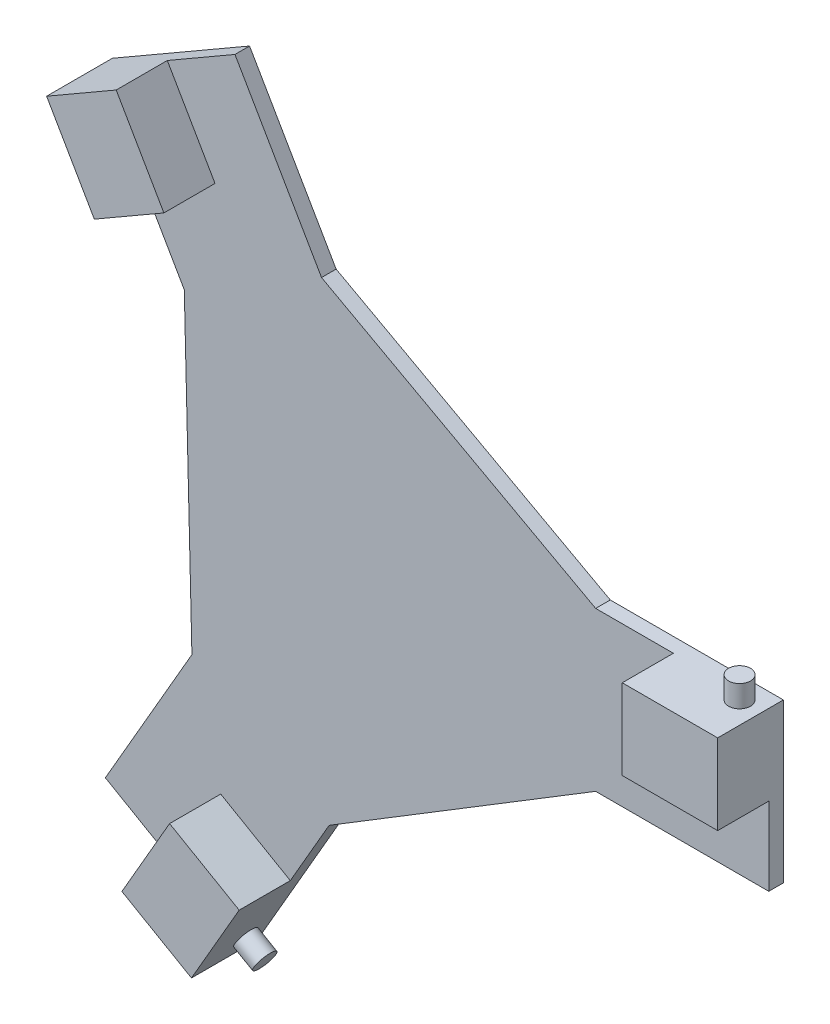
ISO-10303-21;
HEADER;
FILE_DESCRIPTION(('STEP AP214'),'2;1');
FILE_NAME('part.step','',(''),(''),'','','');
FILE_SCHEMA(('AUTOMOTIVE_DESIGN { 1 0 10303 214 1 1 1 1 }'));
ENDSEC;
DATA;
#1=APPLICATION_CONTEXT('core data for automotive mechanical design processes');
#2=APPLICATION_PROTOCOL_DEFINITION('international standard','automotive_design',2000,#1);
#3=PRODUCT_CONTEXT('',#1,'mechanical');
#4=PRODUCT('Part','Part','',(#3));
#5=PRODUCT_RELATED_PRODUCT_CATEGORY('part','',(#4));
#6=PRODUCT_DEFINITION_FORMATION('','',#4);
#7=PRODUCT_DEFINITION_CONTEXT('part definition',#1,'design');
#8=PRODUCT_DEFINITION('design','',#6,#7);
#9=PRODUCT_DEFINITION_SHAPE('','',#8);
#10=(LENGTH_UNIT() NAMED_UNIT(*) SI_UNIT(.MILLI.,.METRE.));
#11=(NAMED_UNIT(*) PLANE_ANGLE_UNIT() SI_UNIT($,.RADIAN.));
#12=(NAMED_UNIT(*) SI_UNIT($,.STERADIAN.) SOLID_ANGLE_UNIT());
#13=UNCERTAINTY_MEASURE_WITH_UNIT(LENGTH_MEASURE(1.E-05),#10,'distance_accuracy_value','');
#14=(GEOMETRIC_REPRESENTATION_CONTEXT(3) GLOBAL_UNCERTAINTY_ASSIGNED_CONTEXT((#13)) GLOBAL_UNIT_ASSIGNED_CONTEXT((#10,
#11,#12)) REPRESENTATION_CONTEXT('',''));
#15=CARTESIAN_POINT('',(0.,0.,0.));
#16=DIRECTION('',(0.,0.,1.));
#17=DIRECTION('',(1.,0.,0.));
#18=AXIS2_PLACEMENT_3D('',#15,#16,#17);
#19=CARTESIAN_POINT('',(30.9389921504268,11.4514451465866,2.));
#20=DIRECTION('',(0.,1.,0.));
#21=DIRECTION('',(0.,0.,1.));
#22=AXIS2_PLACEMENT_3D('',#19,#20,#21);
#23=PLANE('',#22);
#24=DIRECTION('',(1.,0.,0.));
#25=VECTOR('',#24,1.);
#26=CARTESIAN_POINT('',(30.9389921504268,11.4514451465866,0.));
#27=LINE('',#26,#25);
#28=CARTESIAN_POINT('',(30.9389921504268,11.4514451465866,0.));
#29=VERTEX_POINT('',#28);
#30=CARTESIAN_POINT('',(54.6454926293253,11.4514451465866,0.));
#31=VERTEX_POINT('',#30);
#32=EDGE_CURVE('E319',#29,#31,#27,.T.);
#33=ORIENTED_EDGE('',*,*,#32,.F.);
#34=DIRECTION('',(0.,0.,-1.));
#35=VECTOR('',#34,1.);
#36=CARTESIAN_POINT('',(30.9389921504268,11.4514451465866,2.));
#37=LINE('',#36,#35);
#38=CARTESIAN_POINT('',(30.9389921504268,11.4514451465866,2.));
#39=VERTEX_POINT('',#38);
#40=EDGE_CURVE('E341',#39,#29,#37,.T.);
#41=ORIENTED_EDGE('',*,*,#40,.F.);
#42=DIRECTION('',(1.,0.,0.));
#43=VECTOR('',#42,1.);
#44=CARTESIAN_POINT('',(30.9389921504268,11.4514451465866,2.));
#45=LINE('',#44,#43);
#46=CARTESIAN_POINT('',(41.5807599716743,11.4514451465866,2.));
#47=VERTEX_POINT('',#46);
#48=EDGE_CURVE('E381',#39,#47,#45,.T.);
#49=ORIENTED_EDGE('',*,*,#48,.T.);
#50=DIRECTION('',(0.,0.,-1.));
#51=VECTOR('',#50,1.);
#52=CARTESIAN_POINT('',(41.5807599716744,11.451445146586,8.99999999999999));
#53=LINE('',#52,#51);
#54=CARTESIAN_POINT('',(41.5807599716744,11.451445146586,8.99999999999999));
#55=VERTEX_POINT('',#54);
#56=EDGE_CURVE('E237',#55,#47,#53,.T.);
#57=ORIENTED_EDGE('',*,*,#56,.F.);
#58=DIRECTION('',(-1.,0.,0.));
#59=VECTOR('',#58,1.);
#60=CARTESIAN_POINT('',(41.5807599716744,11.451445146586,8.99999999999999));
#61=LINE('',#60,#59);
#62=CARTESIAN_POINT('',(54.6454926293255,11.4514451465858,8.99999999999999));
#63=VERTEX_POINT('',#62);
#64=EDGE_CURVE('E223',#63,#55,#61,.T.);
#65=ORIENTED_EDGE('',*,*,#64,.F.);
#66=DIRECTION('',(0.,0.,-1.));
#67=VECTOR('',#66,1.);
#68=CARTESIAN_POINT('',(54.6454926293253,11.4514451465866,2.));
#69=LINE('',#68,#67);
#70=EDGE_CURVE('E343',#63,#31,#69,.T.);
#71=ORIENTED_EDGE('',*,*,#70,.T.);
#72=EDGE_LOOP('',(#33,#41,#49,#57,#65,#71));
#73=FACE_BOUND('',#72,.T.);
#74=CARTESIAN_POINT('',(51.6454926293224,11.4514451465866,2.99999999999295));
#75=DIRECTION('',(0.,1.,0.));
#76=DIRECTION('',(0.,0.,1.));
#77=AXIS2_PLACEMENT_3D('',#74,#75,#76);
#78=CIRCLE('',#77,1.5);
#79=CARTESIAN_POINT('',(51.6454926293224,11.4514451465866,4.49999999999296));
#80=VERTEX_POINT('',#79);
#81=EDGE_CURVE('E697',#80,#80,#78,.T.);
#82=ORIENTED_EDGE('',*,*,#81,.F.);
#83=EDGE_LOOP('',(#82));
#84=FACE_BOUND('',#83,.T.);
#85=ADVANCED_FACE('F32',(#73,#84),#23,.T.);
#86=CARTESIAN_POINT('',(-5.55225366822558,-32.5196757430502,2.));
#87=DIRECTION('',(0.866025403784436,-0.500000000000004,0.));
#88=DIRECTION('',(0.500000000000004,0.866025403784436,0.));
#89=AXIS2_PLACEMENT_3D('',#86,#87,#88);
#90=PLANE('',#89);
#91=DIRECTION('',(-0.500000000000004,-0.866025403784436,0.));
#92=VECTOR('',#91,1.);
#93=CARTESIAN_POINT('',(-5.55225366822558,-32.5196757430502,0.));
#94=LINE('',#93,#92);
#95=CARTESIAN_POINT('',(-5.55225366822558,-32.5196757430502,0.));
#96=VERTEX_POINT('',#95);
#97=CARTESIAN_POINT('',(-17.4055039076749,-53.0501073926042,0.));
#98=VERTEX_POINT('',#97);
#99=EDGE_CURVE('E308',#96,#98,#94,.T.);
#100=ORIENTED_EDGE('',*,*,#99,.F.);
#101=DIRECTION('',(0.,0.,-1.));
#102=VECTOR('',#101,1.);
#103=CARTESIAN_POINT('',(-5.55225366822558,-32.5196757430502,2.));
#104=LINE('',#103,#102);
#105=CARTESIAN_POINT('',(-5.55225366822558,-32.5196757430502,2.));
#106=VERTEX_POINT('',#105);
#107=EDGE_CURVE('E186',#106,#96,#104,.T.);
#108=ORIENTED_EDGE('',*,*,#107,.F.);
#109=DIRECTION('',(-0.500000000000004,-0.866025403784436,0.));
#110=VECTOR('',#109,1.);
#111=CARTESIAN_POINT('',(-5.55225366822558,-32.5196757430502,2.));
#112=LINE('',#111,#110);
#113=CARTESIAN_POINT('',(-10.8731375788499,-41.7357170174261,2.));
#114=VERTEX_POINT('',#113);
#115=EDGE_CURVE('E364',#106,#114,#112,.T.);
#116=ORIENTED_EDGE('',*,*,#115,.T.);
#117=DIRECTION('',(0.,0.,-1.));
#118=VECTOR('',#117,1.);
#119=CARTESIAN_POINT('',(-10.8731375788499,-41.7357170174261,8.99999999999999));
#120=LINE('',#119,#118);
#121=CARTESIAN_POINT('',(-10.8731375788499,-41.7357170174261,8.99999999999999));
#122=VERTEX_POINT('',#121);
#123=EDGE_CURVE('E193',#122,#114,#120,.T.);
#124=ORIENTED_EDGE('',*,*,#123,.F.);
#125=DIRECTION('',(0.500000000000016,0.866025403784429,0.));
#126=VECTOR('',#125,1.);
#127=CARTESIAN_POINT('',(-10.8731375788499,-41.7357170174261,8.99999999999999));
#128=LINE('',#127,#126);
#129=CARTESIAN_POINT('',(-17.4055039076757,-53.050107392604,8.99999999999999));
#130=VERTEX_POINT('',#129);
#131=EDGE_CURVE('E189',#130,#122,#128,.T.);
#132=ORIENTED_EDGE('',*,*,#131,.F.);
#133=DIRECTION('',(0.,0.,-1.));
#134=VECTOR('',#133,1.);
#135=CARTESIAN_POINT('',(-17.4055039076749,-53.0501073926042,2.));
#136=LINE('',#135,#134);
#137=EDGE_CURVE('E175',#130,#98,#136,.T.);
#138=ORIENTED_EDGE('',*,*,#137,.T.);
#139=EDGE_LOOP('',(#100,#108,#116,#124,#132,#138));
#140=FACE_BOUND('',#139,.T.);
#141=CARTESIAN_POINT('',(-15.905503907675,-50.452031181251,3.05755616312808));
#142=DIRECTION('',(0.866025403784436,-0.500000000000004,0.));
#143=DIRECTION('',(0.500000000000004,0.866025403784436,0.));
#144=AXIS2_PLACEMENT_3D('',#141,#142,#143);
#145=CIRCLE('',#144,1.5);
#146=CARTESIAN_POINT('',(-15.155503907675,-49.1529930755744,3.05755616312808));
#147=VERTEX_POINT('',#146);
#148=EDGE_CURVE('E696',#147,#147,#145,.T.);
#149=ORIENTED_EDGE('',*,*,#148,.F.);
#150=EDGE_LOOP('',(#149));
#151=FACE_BOUND('',#150,.T.);
#152=ADVANCED_FACE('F190',(#140,#151),#90,.T.);
#153=CARTESIAN_POINT('',(-25.3867384822012,21.0682305964639,2.));
#154=DIRECTION('',(-0.866025403784443,-0.499999999999992,0.));
#155=DIRECTION('',(0.499999999999992,-0.866025403784443,0.));
#156=AXIS2_PLACEMENT_3D('',#153,#154,#155);
#157=PLANE('',#156);
#158=DIRECTION('',(-0.499999999999992,0.866025403784443,0.));
#159=VECTOR('',#158,1.);
#160=CARTESIAN_POINT('',(-25.3867384822012,21.0682305964639,2.));
#161=LINE('',#160,#159);
#162=CARTESIAN_POINT('',(-25.3867384822012,21.0682305964639,2.));
#163=VERTEX_POINT('',#162);
#164=CARTESIAN_POINT('',(-30.7076223928248,30.28427187084,2.));
#165=VERTEX_POINT('',#164);
#166=EDGE_CURVE('E288',#163,#165,#161,.T.);
#167=ORIENTED_EDGE('',*,*,#166,.T.);
#168=DIRECTION('',(0.,0.,1.));
#169=VECTOR('',#168,1.);
#170=CARTESIAN_POINT('',(-30.7076223928248,30.28427187084,8.85423510445075));
#171=LINE('',#170,#169);
#172=CARTESIAN_POINT('',(-30.7076223928248,30.28427187084,8.99999999999999));
#173=VERTEX_POINT('',#172);
#174=EDGE_CURVE('E252',#165,#173,#171,.T.);
#175=ORIENTED_EDGE('',*,*,#174,.T.);
#176=DIRECTION('',(0.499999999999992,-0.866025403784443,0.));
#177=VECTOR('',#176,1.);
#178=CARTESIAN_POINT('',(-30.7076223928248,30.28427187084,8.99999999999999));
#179=LINE('',#178,#177);
#180=CARTESIAN_POINT('',(-37.2399887216502,41.5986622460181,8.99999999999999));
#181=VERTEX_POINT('',#180);
#182=EDGE_CURVE('E240',#181,#173,#179,.T.);
#183=ORIENTED_EDGE('',*,*,#182,.F.);
#184=DIRECTION('',(0.,0.,-1.));
#185=VECTOR('',#184,1.);
#186=CARTESIAN_POINT('',(-37.2399887216502,41.5986622460181,2.));
#187=LINE('',#186,#185);
#188=CARTESIAN_POINT('',(-37.2399887216502,41.5986622460181,0.));
#189=VERTEX_POINT('',#188);
#190=EDGE_CURVE('E335',#181,#189,#187,.T.);
#191=ORIENTED_EDGE('',*,*,#190,.T.);
#192=DIRECTION('',(-0.499999999999992,0.866025403784443,0.));
#193=VECTOR('',#192,1.);
#194=CARTESIAN_POINT('',(-25.3867384822012,21.0682305964639,0.));
#195=LINE('',#194,#193);
#196=CARTESIAN_POINT('',(-25.3867384822012,21.0682305964639,0.));
#197=VERTEX_POINT('',#196);
#198=EDGE_CURVE('E331',#197,#189,#195,.T.);
#199=ORIENTED_EDGE('',*,*,#198,.F.);
#200=DIRECTION('',(0.,0.,-1.));
#201=VECTOR('',#200,1.);
#202=CARTESIAN_POINT('',(-25.3867384822012,21.0682305964639,2.));
#203=LINE('',#202,#201);
#204=EDGE_CURVE('E291',#163,#197,#203,.T.);
#205=ORIENTED_EDGE('',*,*,#204,.F.);
#206=EDGE_LOOP('',(#167,#175,#183,#191,#199,#205));
#207=FACE_BOUND('',#206,.T.);
#208=CARTESIAN_POINT('',(-35.7399887216488,39.0005860346621,2.99999999999295));
#209=DIRECTION('',(-0.866025403784443,-0.499999999999992,0.));
#210=DIRECTION('',(0.499999999999992,-0.866025403784443,0.));
#211=AXIS2_PLACEMENT_3D('',#208,#209,#210);
#212=CIRCLE('',#211,1.5);
#213=CARTESIAN_POINT('',(-34.9899887216488,37.7015479289855,2.99999999999295));
#214=VERTEX_POINT('',#213);
#215=EDGE_CURVE('E207',#214,#214,#212,.T.);
#216=ORIENTED_EDGE('',*,*,#215,.F.);
#217=EDGE_LOOP('',(#216));
#218=FACE_BOUND('',#217,.T.);
#219=ADVANCED_FACE('F392',(#207,#218),#157,.T.);
#220=CARTESIAN_POINT('',(-24.6218759073957,-10.2460298679985,2.));
#221=DIRECTION('',(0.,0.,-1.));
#222=DIRECTION('',(-1.,0.,0.));
#223=AXIS2_PLACEMENT_3D('',#220,#221,#222);
#224=PLANE('',#223);
#225=DIRECTION('',(-0.866025403784429,0.500000000000016,0.));
#226=VECTOR('',#225,1.);
#227=CARTESIAN_POINT('',(-20.3994170204787,-36.2357170174259,2.));
#228=LINE('',#227,#226);
#229=CARTESIAN_POINT('',(-20.3994170204787,-36.2357170174259,2.));
#230=VERTEX_POINT('',#229);
#231=EDGE_CURVE('E204',#114,#230,#228,.T.);
#232=ORIENTED_EDGE('',*,*,#231,.F.);
#233=ORIENTED_EDGE('',*,*,#115,.F.);
#234=DIRECTION('',(0.853558137972642,0.520997605657335,0.));
#235=VECTOR('',#234,1.);
#236=CARTESIAN_POINT('',(-5.55225366822558,-32.5196757430502,2.));
#237=LINE('',#236,#235);
#238=CARTESIAN_POINT('',(30.9389921504268,-10.2460298679985,2.));
#239=VERTEX_POINT('',#238);
#240=EDGE_CURVE('E367',#106,#239,#237,.T.);
#241=ORIENTED_EDGE('',*,*,#240,.T.);
#242=DIRECTION('',(-1.,0.,0.));
#243=VECTOR('',#242,1.);
#244=CARTESIAN_POINT('',(54.6454926293253,-10.2460298679985,2.));
#245=LINE('',#244,#243);
#246=CARTESIAN_POINT('',(54.6454926293253,-10.2460298679985,2.));
#247=VERTEX_POINT('',#246);
#248=EDGE_CURVE('E371',#247,#239,#245,.T.);
#249=ORIENTED_EDGE('',*,*,#248,.F.);
#250=DIRECTION('',(0.,-1.,0.));
#251=VECTOR('',#250,1.);
#252=CARTESIAN_POINT('',(54.6454926293253,11.4514451465866,2.));
#253=LINE('',#252,#251);
#254=CARTESIAN_POINT('',(54.6454926293253,0.451445146585797,2.));
#255=VERTEX_POINT('',#254);
#256=EDGE_CURVE('E379',#255,#247,#253,.T.);
#257=ORIENTED_EDGE('',*,*,#256,.F.);
#258=DIRECTION('',(1.,0.,0.));
#259=VECTOR('',#258,1.);
#260=CARTESIAN_POINT('',(54.6454926293253,0.451445146585797,2.));
#261=LINE('',#260,#259);
#262=CARTESIAN_POINT('',(41.5807599716743,0.451445146585981,2.));
#263=VERTEX_POINT('',#262);
#264=EDGE_CURVE('E49',#263,#255,#261,.T.);
#265=ORIENTED_EDGE('',*,*,#264,.F.);
#266=DIRECTION('',(0.,-1.,0.));
#267=VECTOR('',#266,1.);
#268=CARTESIAN_POINT('',(41.5807599716743,0.451445146585981,2.));
#269=LINE('',#268,#267);
#270=EDGE_CURVE('E53',#47,#263,#269,.T.);
#271=ORIENTED_EDGE('',*,*,#270,.F.);
#272=ORIENTED_EDGE('',*,*,#48,.F.);
#273=DIRECTION('',(0.877976230796439,-0.478704228262585,0.));
#274=VECTOR('',#273,1.);
#275=CARTESIAN_POINT('',(-6.59617392159228,31.9169681037563,2.));
#276=LINE('',#275,#274);
#277=CARTESIAN_POINT('',(-6.59617392159228,31.9169681037563,2.));
#278=VERTEX_POINT('',#277);
#279=EDGE_CURVE('E293',#278,#39,#276,.T.);
#280=ORIENTED_EDGE('',*,*,#279,.F.);
#281=DIRECTION('',(0.499999999999992,-0.866025403784443,0.));
#282=VECTOR('',#281,1.);
#283=CARTESIAN_POINT('',(-18.4494241610413,52.4473997533104,2.));
#284=LINE('',#283,#282);
#285=CARTESIAN_POINT('',(-18.4494241610413,52.4473997533104,2.));
#286=VERTEX_POINT('',#285);
#287=EDGE_CURVE('E287',#286,#278,#284,.T.);
#288=ORIENTED_EDGE('',*,*,#287,.F.);
#289=DIRECTION('',(0.866025403784443,0.499999999999992,0.));
#290=VECTOR('',#289,1.);
#291=CARTESIAN_POINT('',(-37.2399887216502,41.5986622460181,2.));
#292=LINE('',#291,#290);
#293=CARTESIAN_POINT('',(-27.7137092800214,47.098662246018,2.));
#294=VERTEX_POINT('',#293);
#295=EDGE_CURVE('E278',#294,#286,#292,.T.);
#296=ORIENTED_EDGE('',*,*,#295,.F.);
#297=DIRECTION('',(0.499999999999992,-0.866025403784443,0.));
#298=VECTOR('',#297,1.);
#299=CARTESIAN_POINT('',(-21.1813429511959,35.7842718708399,2.));
#300=LINE('',#299,#298);
#301=CARTESIAN_POINT('',(-21.1813429511959,35.7842718708399,2.));
#302=VERTEX_POINT('',#301);
#303=EDGE_CURVE('E256',#294,#302,#300,.T.);
#304=ORIENTED_EDGE('',*,*,#303,.T.);
#305=DIRECTION('',(-0.866025403784443,-0.499999999999992,0.));
#306=VECTOR('',#305,1.);
#307=CARTESIAN_POINT('',(-21.1813429511959,35.7842718708399,2.));
#308=LINE('',#307,#306);
#309=EDGE_CURVE('E262',#302,#165,#308,.T.);
#310=ORIENTED_EDGE('',*,*,#309,.T.);
#311=ORIENTED_EDGE('',*,*,#166,.F.);
#312=DIRECTION('',(0.0244180928237938,-0.999701833919919,0.));
#313=VECTOR('',#312,1.);
#314=CARTESIAN_POINT('',(-25.3867384822012,21.0682305964639,2.));
#315=LINE('',#314,#313);
#316=CARTESIAN_POINT('',(-24.3428182288343,-21.6709382357576,2.));
#317=VERTEX_POINT('',#316);
#318=EDGE_CURVE('E259',#163,#317,#315,.T.);
#319=ORIENTED_EDGE('',*,*,#318,.T.);
#320=DIRECTION('',(0.500000000000004,0.866025403784436,0.));
#321=VECTOR('',#320,1.);
#322=CARTESIAN_POINT('',(-36.1960684682837,-42.2013698853116,2.));
#323=LINE('',#322,#321);
#324=CARTESIAN_POINT('',(-36.1960684682837,-42.2013698853116,2.));
#325=VERTEX_POINT('',#324);
#326=EDGE_CURVE('E375',#325,#317,#323,.T.);
#327=ORIENTED_EDGE('',*,*,#326,.F.);
#328=DIRECTION('',(-0.866025403784436,0.500000000000004,0.));
#329=VECTOR('',#328,1.);
#330=CARTESIAN_POINT('',(-17.4055039076749,-53.0501073926042,2.));
#331=LINE('',#330,#329);
#332=CARTESIAN_POINT('',(-26.9317833493044,-47.5501073926038,2.));
#333=VERTEX_POINT('',#332);
#334=EDGE_CURVE('E352',#333,#325,#331,.T.);
#335=ORIENTED_EDGE('',*,*,#334,.F.);
#336=DIRECTION('',(-0.500000000000016,-0.866025403784429,0.));
#337=VECTOR('',#336,1.);
#338=CARTESIAN_POINT('',(-26.9317833493044,-47.5501073926038,2.));
#339=LINE('',#338,#337);
#340=EDGE_CURVE('E202',#230,#333,#339,.T.);
#341=ORIENTED_EDGE('',*,*,#340,.F.);
#342=EDGE_LOOP('',(#232,#233,#241,#249,#257,#265,#271,#272,#280,#288,#296,#304,#310,#311,#319,
#327,#335,#341));
#343=FACE_BOUND('',#342,.T.);
#344=ADVANCED_FACE('F284',(#343),#224,.F.);
#345=CARTESIAN_POINT('',(-25.3867384822012,21.0682305964639,2.));
#346=DIRECTION('',(0.999701833919919,0.0244180928237938,0.));
#347=DIRECTION('',(-0.0244180928237938,0.999701833919919,0.));
#348=AXIS2_PLACEMENT_3D('',#345,#346,#347);
#349=PLANE('',#348);
#350=DIRECTION('',(0.0244180928237938,-0.999701833919919,0.));
#351=VECTOR('',#350,1.);
#352=CARTESIAN_POINT('',(-25.3867384822012,21.0682305964639,0.));
#353=LINE('',#352,#351);
#354=CARTESIAN_POINT('',(-24.3428182288343,-21.6709382357576,0.));
#355=VERTEX_POINT('',#354);
#356=EDGE_CURVE('E266',#197,#355,#353,.T.);
#357=ORIENTED_EDGE('',*,*,#356,.T.);
#358=DIRECTION('',(0.,0.,-1.));
#359=VECTOR('',#358,1.);
#360=CARTESIAN_POINT('',(-24.3428182288343,-21.6709382357576,2.));
#361=LINE('',#360,#359);
#362=EDGE_CURVE('E11',#317,#355,#361,.T.);
#363=ORIENTED_EDGE('',*,*,#362,.F.);
#364=ORIENTED_EDGE('',*,*,#318,.F.);
#365=ORIENTED_EDGE('',*,*,#204,.T.);
#366=EDGE_LOOP('',(#357,#363,#364,#365));
#367=FACE_BOUND('',#366,.T.);
#368=ADVANCED_FACE('F34',(#367),#349,.F.);
#369=CARTESIAN_POINT('',(-36.1960684682837,-42.2013698853116,2.));
#370=DIRECTION('',(-0.866025403784436,0.500000000000004,0.));
#371=DIRECTION('',(-0.500000000000004,-0.866025403784436,0.));
#372=AXIS2_PLACEMENT_3D('',#369,#370,#371);
#373=PLANE('',#372);
#374=DIRECTION('',(0.500000000000004,0.866025403784436,0.));
#375=VECTOR('',#374,1.);
#376=CARTESIAN_POINT('',(-36.1960684682837,-42.2013698853116,0.));
#377=LINE('',#376,#375);
#378=CARTESIAN_POINT('',(-36.1960684682837,-42.2013698853116,0.));
#379=VERTEX_POINT('',#378);
#380=EDGE_CURVE('E304',#379,#355,#377,.T.);
#381=ORIENTED_EDGE('',*,*,#380,.F.);
#382=DIRECTION('',(0.,0.,-1.));
#383=VECTOR('',#382,1.);
#384=CARTESIAN_POINT('',(-36.1960684682837,-42.2013698853116,2.));
#385=LINE('',#384,#383);
#386=EDGE_CURVE('E41',#325,#379,#385,.T.);
#387=ORIENTED_EDGE('',*,*,#386,.F.);
#388=ORIENTED_EDGE('',*,*,#326,.T.);
#389=ORIENTED_EDGE('',*,*,#362,.T.);
#390=EDGE_LOOP('',(#381,#387,#388,#389));
#391=FACE_BOUND('',#390,.T.);
#392=ADVANCED_FACE('F356',(#391),#373,.T.);
#393=CARTESIAN_POINT('',(-17.4055039076749,-53.0501073926042,2.));
#394=DIRECTION('',(-0.500000000000004,-0.866025403784436,0.));
#395=DIRECTION('',(0.866025403784436,-0.500000000000004,0.));
#396=AXIS2_PLACEMENT_3D('',#393,#394,#395);
#397=PLANE('',#396);
#398=DIRECTION('',(-0.866025403784436,0.500000000000004,0.));
#399=VECTOR('',#398,1.);
#400=CARTESIAN_POINT('',(-17.4055039076749,-53.0501073926042,0.));
#401=LINE('',#400,#399);
#402=EDGE_CURVE('E182',#98,#379,#401,.T.);
#403=ORIENTED_EDGE('',*,*,#402,.F.);
#404=ORIENTED_EDGE('',*,*,#137,.F.);
#405=DIRECTION('',(0.86602540378443,-0.500000000000016,0.));
#406=VECTOR('',#405,1.);
#407=CARTESIAN_POINT('',(-17.4055039076757,-53.050107392604,8.99999999999999));
#408=LINE('',#407,#406);
#409=CARTESIAN_POINT('',(-26.9317833493044,-47.5501073926038,8.99999999999999));
#410=VERTEX_POINT('',#409);
#411=EDGE_CURVE('E180',#410,#130,#408,.T.);
#412=ORIENTED_EDGE('',*,*,#411,.F.);
#413=DIRECTION('',(0.,0.,-1.));
#414=VECTOR('',#413,1.);
#415=CARTESIAN_POINT('',(-26.9317833493044,-47.5501073926038,8.99999999999999));
#416=LINE('',#415,#414);
#417=EDGE_CURVE('E212',#410,#333,#416,.T.);
#418=ORIENTED_EDGE('',*,*,#417,.T.);
#419=ORIENTED_EDGE('',*,*,#334,.T.);
#420=ORIENTED_EDGE('',*,*,#386,.T.);
#421=EDGE_LOOP('',(#403,#404,#412,#418,#419,#420));
#422=FACE_BOUND('',#421,.T.);
#423=ADVANCED_FACE('F177',(#422),#397,.T.);
#424=CARTESIAN_POINT('',(-5.55225366822558,-32.5196757430502,2.));
#425=DIRECTION('',(-0.520997605657335,0.853558137972642,0.));
#426=DIRECTION('',(-0.853558137972642,-0.520997605657335,0.));
#427=AXIS2_PLACEMENT_3D('',#424,#425,#426);
#428=PLANE('',#427);
#429=DIRECTION('',(0.853558137972642,0.520997605657335,0.));
#430=VECTOR('',#429,1.);
#431=CARTESIAN_POINT('',(-5.55225366822558,-32.5196757430502,0.));
#432=LINE('',#431,#430);
#433=CARTESIAN_POINT('',(30.9389921504268,-10.2460298679985,0.));
#434=VERTEX_POINT('',#433);
#435=EDGE_CURVE('E310',#96,#434,#432,.T.);
#436=ORIENTED_EDGE('',*,*,#435,.T.);
#437=DIRECTION('',(0.,0.,-1.));
#438=VECTOR('',#437,1.);
#439=CARTESIAN_POINT('',(30.9389921504268,-10.2460298679985,2.));
#440=LINE('',#439,#438);
#441=EDGE_CURVE('E347',#239,#434,#440,.T.);
#442=ORIENTED_EDGE('',*,*,#441,.F.);
#443=ORIENTED_EDGE('',*,*,#240,.F.);
#444=ORIENTED_EDGE('',*,*,#107,.T.);
#445=EDGE_LOOP('',(#436,#442,#443,#444));
#446=FACE_BOUND('',#445,.T.);
#447=ADVANCED_FACE('F368',(#446),#428,.F.);
#448=CARTESIAN_POINT('',(54.6454926293253,-10.2460298679985,2.));
#449=DIRECTION('',(0.,-1.,0.));
#450=DIRECTION('',(0.,0.,-1.));
#451=AXIS2_PLACEMENT_3D('',#448,#449,#450);
#452=PLANE('',#451);
#453=DIRECTION('',(-1.,0.,0.));
#454=VECTOR('',#453,1.);
#455=CARTESIAN_POINT('',(54.6454926293253,-10.2460298679985,0.));
#456=LINE('',#455,#454);
#457=CARTESIAN_POINT('',(54.6454926293253,-10.2460298679985,0.));
#458=VERTEX_POINT('',#457);
#459=EDGE_CURVE('E313',#458,#434,#456,.T.);
#460=ORIENTED_EDGE('',*,*,#459,.F.);
#461=DIRECTION('',(0.,0.,-1.));
#462=VECTOR('',#461,1.);
#463=CARTESIAN_POINT('',(54.6454926293253,-10.2460298679985,2.));
#464=LINE('',#463,#462);
#465=EDGE_CURVE('E345',#247,#458,#464,.T.);
#466=ORIENTED_EDGE('',*,*,#465,.F.);
#467=ORIENTED_EDGE('',*,*,#248,.T.);
#468=ORIENTED_EDGE('',*,*,#441,.T.);
#469=EDGE_LOOP('',(#460,#466,#467,#468));
#470=FACE_BOUND('',#469,.T.);
#471=ADVANCED_FACE('F425',(#470),#452,.T.);
#472=CARTESIAN_POINT('',(54.6454926293253,11.4514451465866,2.));
#473=DIRECTION('',(1.,0.,0.));
#474=DIRECTION('',(0.,0.,-1.));
#475=AXIS2_PLACEMENT_3D('',#472,#473,#474);
#476=PLANE('',#475);
#477=DIRECTION('',(0.,-1.,0.));
#478=VECTOR('',#477,1.);
#479=CARTESIAN_POINT('',(54.6454926293253,11.4514451465866,0.));
#480=LINE('',#479,#478);
#481=EDGE_CURVE('E316',#31,#458,#480,.T.);
#482=ORIENTED_EDGE('',*,*,#481,.F.);
#483=ORIENTED_EDGE('',*,*,#70,.F.);
#484=DIRECTION('',(0.,1.,0.));
#485=VECTOR('',#484,1.);
#486=CARTESIAN_POINT('',(54.6454926293255,11.4514451465858,8.99999999999999));
#487=LINE('',#486,#485);
#488=CARTESIAN_POINT('',(54.6454926293253,0.451445146585797,8.99999999999999));
#489=VERTEX_POINT('',#488);
#490=EDGE_CURVE('E220',#489,#63,#487,.T.);
#491=ORIENTED_EDGE('',*,*,#490,.F.);
#492=DIRECTION('',(0.,0.,-1.));
#493=VECTOR('',#492,1.);
#494=CARTESIAN_POINT('',(54.6454926293253,0.451445146585797,8.99999999999999));
#495=LINE('',#494,#493);
#496=EDGE_CURVE('E229',#489,#255,#495,.T.);
#497=ORIENTED_EDGE('',*,*,#496,.T.);
#498=ORIENTED_EDGE('',*,*,#256,.T.);
#499=ORIENTED_EDGE('',*,*,#465,.T.);
#500=EDGE_LOOP('',(#482,#483,#491,#497,#498,#499));
#501=FACE_BOUND('',#500,.T.);
#502=ADVANCED_FACE('F422',(#501),#476,.T.);
#503=CARTESIAN_POINT('',(-6.59617392159228,31.9169681037563,2.));
#504=DIRECTION('',(0.478704228262585,0.877976230796439,0.));
#505=DIRECTION('',(-0.87797623079644,0.478704228262585,0.));
#506=AXIS2_PLACEMENT_3D('',#503,#504,#505);
#507=PLANE('',#506);
#508=DIRECTION('',(0.877976230796439,-0.478704228262585,0.));
#509=VECTOR('',#508,1.);
#510=CARTESIAN_POINT('',(-6.59617392159228,31.9169681037563,0.));
#511=LINE('',#510,#509);
#512=CARTESIAN_POINT('',(-6.59617392159228,31.9169681037563,0.));
#513=VERTEX_POINT('',#512);
#514=EDGE_CURVE('E322',#513,#29,#511,.T.);
#515=ORIENTED_EDGE('',*,*,#514,.F.);
#516=DIRECTION('',(0.,0.,-1.));
#517=VECTOR('',#516,1.);
#518=CARTESIAN_POINT('',(-6.59617392159228,31.9169681037563,2.));
#519=LINE('',#518,#517);
#520=EDGE_CURVE('E339',#278,#513,#519,.T.);
#521=ORIENTED_EDGE('',*,*,#520,.F.);
#522=ORIENTED_EDGE('',*,*,#279,.T.);
#523=ORIENTED_EDGE('',*,*,#40,.T.);
#524=EDGE_LOOP('',(#515,#521,#522,#523));
#525=FACE_BOUND('',#524,.T.);
#526=ADVANCED_FACE('F385',(#525),#507,.T.);
#527=CARTESIAN_POINT('',(-18.4494241610413,52.4473997533104,2.));
#528=DIRECTION('',(0.866025403784443,0.499999999999992,0.));
#529=DIRECTION('',(-0.499999999999992,0.866025403784443,0.));
#530=AXIS2_PLACEMENT_3D('',#527,#528,#529);
#531=PLANE('',#530);
#532=DIRECTION('',(0.499999999999992,-0.866025403784443,0.));
#533=VECTOR('',#532,1.);
#534=CARTESIAN_POINT('',(-18.4494241610413,52.4473997533104,0.));
#535=LINE('',#534,#533);
#536=CARTESIAN_POINT('',(-18.4494241610413,52.4473997533104,0.));
#537=VERTEX_POINT('',#536);
#538=EDGE_CURVE('E325',#537,#513,#535,.T.);
#539=ORIENTED_EDGE('',*,*,#538,.F.);
#540=DIRECTION('',(0.,0.,-1.));
#541=VECTOR('',#540,1.);
#542=CARTESIAN_POINT('',(-18.4494241610413,52.4473997533104,2.));
#543=LINE('',#542,#541);
#544=EDGE_CURVE('E337',#286,#537,#543,.T.);
#545=ORIENTED_EDGE('',*,*,#544,.F.);
#546=ORIENTED_EDGE('',*,*,#287,.T.);
#547=ORIENTED_EDGE('',*,*,#520,.T.);
#548=EDGE_LOOP('',(#539,#545,#546,#547));
#549=FACE_BOUND('',#548,.T.);
#550=ADVANCED_FACE('F389',(#549),#531,.T.);
#551=CARTESIAN_POINT('',(-37.2399887216502,41.5986622460181,2.));
#552=DIRECTION('',(-0.499999999999992,0.866025403784443,0.));
#553=DIRECTION('',(-0.866025403784443,-0.499999999999992,0.));
#554=AXIS2_PLACEMENT_3D('',#551,#552,#553);
#555=PLANE('',#554);
#556=DIRECTION('',(0.866025403784443,0.499999999999992,0.));
#557=VECTOR('',#556,1.);
#558=CARTESIAN_POINT('',(-37.2399887216502,41.5986622460181,0.));
#559=LINE('',#558,#557);
#560=EDGE_CURVE('E328',#189,#537,#559,.T.);
#561=ORIENTED_EDGE('',*,*,#560,.F.);
#562=ORIENTED_EDGE('',*,*,#190,.F.);
#563=DIRECTION('',(-0.866025403784443,-0.499999999999992,0.));
#564=VECTOR('',#563,1.);
#565=CARTESIAN_POINT('',(-37.2399887216502,41.5986622460181,8.99999999999999));
#566=LINE('',#565,#564);
#567=CARTESIAN_POINT('',(-27.7137092800214,47.098662246018,8.99999999999999));
#568=VERTEX_POINT('',#567);
#569=EDGE_CURVE('E249',#568,#181,#566,.T.);
#570=ORIENTED_EDGE('',*,*,#569,.F.);
#571=DIRECTION('',(0.,0.,-1.));
#572=VECTOR('',#571,1.);
#573=CARTESIAN_POINT('',(-27.7137092800214,47.098662246018,2.));
#574=LINE('',#573,#572);
#575=EDGE_CURVE('E255',#568,#294,#574,.T.);
#576=ORIENTED_EDGE('',*,*,#575,.T.);
#577=ORIENTED_EDGE('',*,*,#295,.T.);
#578=ORIENTED_EDGE('',*,*,#544,.T.);
#579=EDGE_LOOP('',(#561,#562,#570,#576,#577,#578));
#580=FACE_BOUND('',#579,.T.);
#581=ADVANCED_FACE('F277',(#580),#555,.T.);
#582=CARTESIAN_POINT('',(-24.6218759073957,-10.2460298679985,0.));
#583=DIRECTION('',(0.,0.,-1.));
#584=DIRECTION('',(-1.,0.,0.));
#585=AXIS2_PLACEMENT_3D('',#582,#583,#584);
#586=PLANE('',#585);
#587=ORIENTED_EDGE('',*,*,#356,.F.);
#588=ORIENTED_EDGE('',*,*,#198,.T.);
#589=ORIENTED_EDGE('',*,*,#560,.T.);
#590=ORIENTED_EDGE('',*,*,#538,.T.);
#591=ORIENTED_EDGE('',*,*,#514,.T.);
#592=ORIENTED_EDGE('',*,*,#32,.T.);
#593=ORIENTED_EDGE('',*,*,#481,.T.);
#594=ORIENTED_EDGE('',*,*,#459,.T.);
#595=ORIENTED_EDGE('',*,*,#435,.F.);
#596=ORIENTED_EDGE('',*,*,#99,.T.);
#597=ORIENTED_EDGE('',*,*,#402,.T.);
#598=ORIENTED_EDGE('',*,*,#380,.T.);
#599=EDGE_LOOP('',(#587,#588,#589,#590,#591,#592,#593,#594,#595,#596,#597,#598));
#600=FACE_BOUND('',#599,.T.);
#601=ADVANCED_FACE('F360',(#600),#586,.T.);
#602=CARTESIAN_POINT('',(-21.1813429511959,35.7842718708399,8.85423510445075));
#603=DIRECTION('',(0.499999999999992,-0.866025403784443,0.));
#604=DIRECTION('',(0.866025403784443,0.499999999999992,0.));
#605=AXIS2_PLACEMENT_3D('',#602,#603,#604);
#606=PLANE('',#605);
#607=ORIENTED_EDGE('',*,*,#174,.F.);
#608=ORIENTED_EDGE('',*,*,#309,.F.);
#609=DIRECTION('',(0.,0.,1.));
#610=VECTOR('',#609,1.);
#611=CARTESIAN_POINT('',(-21.1813429511959,35.7842718708399,8.85423510445075));
#612=LINE('',#611,#610);
#613=CARTESIAN_POINT('',(-21.1813429511959,35.7842718708399,8.99999999999999));
#614=VERTEX_POINT('',#613);
#615=EDGE_CURVE('E253',#302,#614,#612,.T.);
#616=ORIENTED_EDGE('',*,*,#615,.T.);
#617=DIRECTION('',(0.866025403784443,0.499999999999992,0.));
#618=VECTOR('',#617,1.);
#619=CARTESIAN_POINT('',(-21.1813429511959,35.7842718708399,8.99999999999999));
#620=LINE('',#619,#618);
#621=EDGE_CURVE('E243',#173,#614,#620,.T.);
#622=ORIENTED_EDGE('',*,*,#621,.F.);
#623=EDGE_LOOP('',(#607,#608,#616,#622));
#624=FACE_BOUND('',#623,.T.);
#625=ADVANCED_FACE('F402',(#624),#606,.T.);
#626=CARTESIAN_POINT('',(-27.7137092800214,47.098662246018,2.));
#627=DIRECTION('',(0.866025403784443,0.499999999999992,0.));
#628=DIRECTION('',(-0.499999999999992,0.866025403784443,0.));
#629=AXIS2_PLACEMENT_3D('',#626,#627,#628);
#630=PLANE('',#629);
#631=ORIENTED_EDGE('',*,*,#303,.F.);
#632=ORIENTED_EDGE('',*,*,#575,.F.);
#633=DIRECTION('',(-0.499999999999992,0.866025403784443,0.));
#634=VECTOR('',#633,1.);
#635=CARTESIAN_POINT('',(-27.7137092800214,47.098662246018,8.99999999999999));
#636=LINE('',#635,#634);
#637=EDGE_CURVE('E246',#614,#568,#636,.T.);
#638=ORIENTED_EDGE('',*,*,#637,.F.);
#639=ORIENTED_EDGE('',*,*,#615,.F.);
#640=EDGE_LOOP('',(#631,#632,#638,#639));
#641=FACE_BOUND('',#640,.T.);
#642=ADVANCED_FACE('F400',(#641),#630,.T.);
#643=CARTESIAN_POINT('',(-37.2399887216502,41.5986622460181,8.99999999999999));
#644=DIRECTION('',(0.,0.,-1.));
#645=DIRECTION('',(-1.,0.,0.));
#646=AXIS2_PLACEMENT_3D('',#643,#644,#645);
#647=PLANE('',#646);
#648=ORIENTED_EDGE('',*,*,#182,.T.);
#649=ORIENTED_EDGE('',*,*,#621,.T.);
#650=ORIENTED_EDGE('',*,*,#637,.T.);
#651=ORIENTED_EDGE('',*,*,#569,.T.);
#652=EDGE_LOOP('',(#648,#649,#650,#651));
#653=FACE_BOUND('',#652,.T.);
#654=ADVANCED_FACE('F398',(#653),#647,.F.);
#655=CARTESIAN_POINT('',(41.5807599716743,0.451445146585981,8.99999999999999));
#656=DIRECTION('',(1.,0.,0.));
#657=DIRECTION('',(0.,1.,0.));
#658=AXIS2_PLACEMENT_3D('',#655,#656,#657);
#659=PLANE('',#658);
#660=ORIENTED_EDGE('',*,*,#270,.T.);
#661=DIRECTION('',(0.,0.,-1.));
#662=VECTOR('',#661,1.);
#663=CARTESIAN_POINT('',(41.5807599716743,0.451445146585981,8.99999999999999));
#664=LINE('',#663,#662);
#665=CARTESIAN_POINT('',(41.5807599716743,0.451445146585981,8.99999999999999));
#666=VERTEX_POINT('',#665);
#667=EDGE_CURVE('E234',#666,#263,#664,.T.);
#668=ORIENTED_EDGE('',*,*,#667,.F.);
#669=DIRECTION('',(0.,-1.,0.));
#670=VECTOR('',#669,1.);
#671=CARTESIAN_POINT('',(41.5807599716743,0.451445146585981,8.99999999999999));
#672=LINE('',#671,#670);
#673=EDGE_CURVE('E225',#55,#666,#672,.T.);
#674=ORIENTED_EDGE('',*,*,#673,.F.);
#675=ORIENTED_EDGE('',*,*,#56,.T.);
#676=EDGE_LOOP('',(#660,#668,#674,#675));
#677=FACE_BOUND('',#676,.T.);
#678=ADVANCED_FACE('F490',(#677),#659,.F.);
#679=CARTESIAN_POINT('',(54.6454926293253,0.451445146585797,8.99999999999999));
#680=DIRECTION('',(0.,1.,0.));
#681=DIRECTION('',(-1.,0.,0.));
#682=AXIS2_PLACEMENT_3D('',#679,#680,#681);
#683=PLANE('',#682);
#684=ORIENTED_EDGE('',*,*,#264,.T.);
#685=ORIENTED_EDGE('',*,*,#496,.F.);
#686=DIRECTION('',(1.,0.,0.));
#687=VECTOR('',#686,1.);
#688=CARTESIAN_POINT('',(54.6454926293253,0.451445146585797,8.99999999999999));
#689=LINE('',#688,#687);
#690=EDGE_CURVE('E227',#666,#489,#689,.T.);
#691=ORIENTED_EDGE('',*,*,#690,.F.);
#692=ORIENTED_EDGE('',*,*,#667,.T.);
#693=EDGE_LOOP('',(#684,#685,#691,#692));
#694=FACE_BOUND('',#693,.T.);
#695=ADVANCED_FACE('F497',(#694),#683,.F.);
#696=CARTESIAN_POINT('',(54.6454926293253,0.451445146585797,8.99999999999999));
#697=DIRECTION('',(0.,0.,-1.));
#698=DIRECTION('',(-1.,0.,0.));
#699=AXIS2_PLACEMENT_3D('',#696,#697,#698);
#700=PLANE('',#699);
#701=ORIENTED_EDGE('',*,*,#490,.T.);
#702=ORIENTED_EDGE('',*,*,#64,.T.);
#703=ORIENTED_EDGE('',*,*,#673,.T.);
#704=ORIENTED_EDGE('',*,*,#690,.T.);
#705=EDGE_LOOP('',(#701,#702,#703,#704));
#706=FACE_BOUND('',#705,.T.);
#707=ADVANCED_FACE('F505',(#706),#700,.F.);
#708=CARTESIAN_POINT('',(-20.3994170204787,-36.2357170174259,8.99999999999999));
#709=DIRECTION('',(-0.500000000000016,-0.86602540378443,0.));
#710=DIRECTION('',(0.866025403784429,-0.500000000000016,0.));
#711=AXIS2_PLACEMENT_3D('',#708,#709,#710);
#712=PLANE('',#711);
#713=ORIENTED_EDGE('',*,*,#231,.T.);
#714=DIRECTION('',(0.,0.,-1.));
#715=VECTOR('',#714,1.);
#716=CARTESIAN_POINT('',(-20.3994170204787,-36.2357170174259,8.99999999999999));
#717=LINE('',#716,#715);
#718=CARTESIAN_POINT('',(-20.3994170204787,-36.2357170174259,8.99999999999999));
#719=VERTEX_POINT('',#718);
#720=EDGE_CURVE('E216',#719,#230,#717,.T.);
#721=ORIENTED_EDGE('',*,*,#720,.F.);
#722=DIRECTION('',(-0.866025403784429,0.500000000000016,0.));
#723=VECTOR('',#722,1.);
#724=CARTESIAN_POINT('',(-20.3994170204787,-36.2357170174259,8.99999999999999));
#725=LINE('',#724,#723);
#726=EDGE_CURVE('E196',#122,#719,#725,.T.);
#727=ORIENTED_EDGE('',*,*,#726,.F.);
#728=ORIENTED_EDGE('',*,*,#123,.T.);
#729=EDGE_LOOP('',(#713,#721,#727,#728));
#730=FACE_BOUND('',#729,.T.);
#731=ADVANCED_FACE('F513',(#730),#712,.F.);
#732=CARTESIAN_POINT('',(-26.9317833493044,-47.5501073926038,8.99999999999999));
#733=DIRECTION('',(0.866025403784429,-0.500000000000016,0.));
#734=DIRECTION('',(0.500000000000016,0.866025403784429,0.));
#735=AXIS2_PLACEMENT_3D('',#732,#733,#734);
#736=PLANE('',#735);
#737=ORIENTED_EDGE('',*,*,#340,.T.);
#738=ORIENTED_EDGE('',*,*,#417,.F.);
#739=DIRECTION('',(-0.500000000000016,-0.866025403784429,0.));
#740=VECTOR('',#739,1.);
#741=CARTESIAN_POINT('',(-26.9317833493044,-47.5501073926038,8.99999999999999));
#742=LINE('',#741,#740);
#743=EDGE_CURVE('E200',#719,#410,#742,.T.);
#744=ORIENTED_EDGE('',*,*,#743,.F.);
#745=ORIENTED_EDGE('',*,*,#720,.T.);
#746=EDGE_LOOP('',(#737,#738,#744,#745));
#747=FACE_BOUND('',#746,.T.);
#748=ADVANCED_FACE('F521',(#747),#736,.F.);
#749=CARTESIAN_POINT('',(-26.9317833493044,-47.5501073926038,8.99999999999999));
#750=DIRECTION('',(0.,0.,-1.));
#751=DIRECTION('',(-1.,0.,0.));
#752=AXIS2_PLACEMENT_3D('',#749,#750,#751);
#753=PLANE('',#752);
#754=ORIENTED_EDGE('',*,*,#411,.T.);
#755=ORIENTED_EDGE('',*,*,#131,.T.);
#756=ORIENTED_EDGE('',*,*,#726,.T.);
#757=ORIENTED_EDGE('',*,*,#743,.T.);
#758=EDGE_LOOP('',(#754,#755,#756,#757));
#759=FACE_BOUND('',#758,.T.);
#760=ADVANCED_FACE('F198',(#759),#753,.F.);
#761=CARTESIAN_POINT('',(-38.3380649330021,37.5005860346622,2.99999999999295));
#762=DIRECTION('',(0.866025403784443,0.499999999999992,0.));
#763=DIRECTION('',(-0.499999999999992,0.866025403784443,0.));
#764=AXIS2_PLACEMENT_3D('',#761,#762,#763);
#765=CYLINDRICAL_SURFACE('',#764,1.5);
#766=CARTESIAN_POINT('',(-38.3380649330021,37.5005860346622,2.99999999999295));
#767=DIRECTION('',(-0.866025403784443,-0.499999999999992,0.));
#768=DIRECTION('',(0.499999999999992,-0.866025403784443,0.));
#769=AXIS2_PLACEMENT_3D('',#766,#767,#768);
#770=CIRCLE('',#769,1.5);
#771=CARTESIAN_POINT('',(-37.5880649330021,36.2015479289855,2.99999999999295));
#772=VERTEX_POINT('',#771);
#773=EDGE_CURVE('E213',#772,#772,#770,.T.);
#774=ORIENTED_EDGE('',*,*,#773,.F.);
#775=EDGE_LOOP('',(#774));
#776=FACE_BOUND('',#775,.T.);
#777=ORIENTED_EDGE('',*,*,#215,.T.);
#778=EDGE_LOOP('',(#777));
#779=FACE_BOUND('',#778,.T.);
#780=ADVANCED_FACE('F536',(#776,#779),#765,.T.);
#781=CARTESIAN_POINT('',(-38.3380649330021,37.5005860346622,2.99999999999295));
#782=DIRECTION('',(-0.866025403784443,-0.499999999999992,0.));
#783=DIRECTION('',(0.499999999999992,-0.866025403784443,0.));
#784=AXIS2_PLACEMENT_3D('',#781,#782,#783);
#785=PLANE('',#784);
#786=ORIENTED_EDGE('',*,*,#773,.T.);
#787=EDGE_LOOP('',(#786));
#788=FACE_BOUND('',#787,.T.);
#789=ADVANCED_FACE('F544',(#788),#785,.T.);
#790=CARTESIAN_POINT('',(-13.3074276963217,-51.952031181251,3.05755616312808));
#791=DIRECTION('',(-0.866025403784436,0.500000000000004,0.));
#792=DIRECTION('',(-0.500000000000004,-0.866025403784436,0.));
#793=AXIS2_PLACEMENT_3D('',#790,#791,#792);
#794=CYLINDRICAL_SURFACE('',#793,1.5);
#795=CARTESIAN_POINT('',(-13.3074276963217,-51.952031181251,3.05755616312808));
#796=DIRECTION('',(0.866025403784436,-0.500000000000004,0.));
#797=DIRECTION('',(0.500000000000004,0.866025403784436,0.));
#798=AXIS2_PLACEMENT_3D('',#795,#796,#797);
#799=CIRCLE('',#798,1.5);
#800=CARTESIAN_POINT('',(-12.5574276963217,-50.6529930755744,3.05755616312808));
#801=VERTEX_POINT('',#800);
#802=EDGE_CURVE('E700',#801,#801,#799,.T.);
#803=ORIENTED_EDGE('',*,*,#802,.F.);
#804=EDGE_LOOP('',(#803));
#805=FACE_BOUND('',#804,.T.);
#806=ORIENTED_EDGE('',*,*,#148,.T.);
#807=EDGE_LOOP('',(#806));
#808=FACE_BOUND('',#807,.T.);
#809=ADVANCED_FACE('F552',(#805,#808),#794,.T.);
#810=CARTESIAN_POINT('',(-13.3074276963217,-51.952031181251,3.05755616312808));
#811=DIRECTION('',(0.866025403784436,-0.500000000000004,0.));
#812=DIRECTION('',(0.500000000000004,0.866025403784436,0.));
#813=AXIS2_PLACEMENT_3D('',#810,#811,#812);
#814=PLANE('',#813);
#815=ORIENTED_EDGE('',*,*,#802,.T.);
#816=EDGE_LOOP('',(#815));
#817=FACE_BOUND('',#816,.T.);
#818=ADVANCED_FACE('F561',(#817),#814,.T.);
#819=CARTESIAN_POINT('',(51.6454926293224,14.4514451465865,2.99999999999295));
#820=DIRECTION('',(0.,-1.,0.));
#821=DIRECTION('',(0.,0.,-1.));
#822=AXIS2_PLACEMENT_3D('',#819,#820,#821);
#823=CYLINDRICAL_SURFACE('',#822,1.5);
#824=CARTESIAN_POINT('',(51.6454926293224,14.4514451465865,2.99999999999295));
#825=DIRECTION('',(0.,1.,0.));
#826=DIRECTION('',(0.,0.,1.));
#827=AXIS2_PLACEMENT_3D('',#824,#825,#826);
#828=CIRCLE('',#827,1.5);
#829=CARTESIAN_POINT('',(51.6454926293224,14.4514451465865,4.49999999999296));
#830=VERTEX_POINT('',#829);
#831=EDGE_CURVE('E695',#830,#830,#828,.T.);
#832=ORIENTED_EDGE('',*,*,#831,.F.);
#833=EDGE_LOOP('',(#832));
#834=FACE_BOUND('',#833,.T.);
#835=ORIENTED_EDGE('',*,*,#81,.T.);
#836=EDGE_LOOP('',(#835));
#837=FACE_BOUND('',#836,.T.);
#838=ADVANCED_FACE('F569',(#834,#837),#823,.T.);
#839=CARTESIAN_POINT('',(51.6454926293224,14.4514451465865,2.99999999999295));
#840=DIRECTION('',(0.,1.,0.));
#841=DIRECTION('',(0.,0.,1.));
#842=AXIS2_PLACEMENT_3D('',#839,#840,#841);
#843=PLANE('',#842);
#844=ORIENTED_EDGE('',*,*,#831,.T.);
#845=EDGE_LOOP('',(#844));
#846=FACE_BOUND('',#845,.T.);
#847=ADVANCED_FACE('F577',(#846),#843,.T.);
#848=CLOSED_SHELL('',(#85,#152,#219,#344,#368,#392,#423,#447,#471,#502,#526,#550,#581,#601,#625,
#642,#654,#678,#695,#707,#731,#748,#760,#780,#789,#809,#818,#838,#847));
#849=MANIFOLD_SOLID_BREP('B2',#848);
#850=ADVANCED_BREP_SHAPE_REPRESENTATION('',(#18,#849),#14);
#851=SHAPE_DEFINITION_REPRESENTATION(#9,#850);
ENDSEC;
END-ISO-10303-21;
